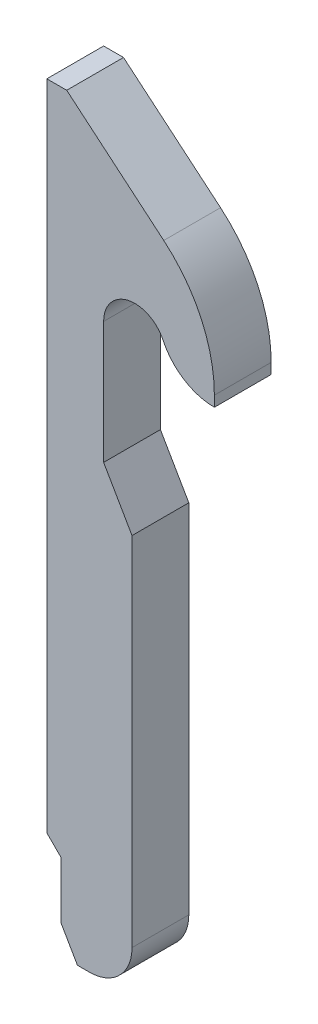
ISO-10303-21;
HEADER;
FILE_DESCRIPTION(('STEP AP214'),'2;1');
FILE_NAME('part.step','',(''),(''),'','','');
FILE_SCHEMA(('AUTOMOTIVE_DESIGN { 1 0 10303 214 1 1 1 1 }'));
ENDSEC;
DATA;
#1=APPLICATION_CONTEXT('core data for automotive mechanical design processes');
#2=APPLICATION_PROTOCOL_DEFINITION('international standard','automotive_design',2000,#1);
#3=PRODUCT_CONTEXT('',#1,'mechanical');
#4=PRODUCT('Part','Part','',(#3));
#5=PRODUCT_RELATED_PRODUCT_CATEGORY('part','',(#4));
#6=PRODUCT_DEFINITION_FORMATION('','',#4);
#7=PRODUCT_DEFINITION_CONTEXT('part definition',#1,'design');
#8=PRODUCT_DEFINITION('design','',#6,#7);
#9=PRODUCT_DEFINITION_SHAPE('','',#8);
#10=(LENGTH_UNIT() NAMED_UNIT(*) SI_UNIT(.MILLI.,.METRE.));
#11=(NAMED_UNIT(*) PLANE_ANGLE_UNIT() SI_UNIT($,.RADIAN.));
#12=(NAMED_UNIT(*) SI_UNIT($,.STERADIAN.) SOLID_ANGLE_UNIT());
#13=UNCERTAINTY_MEASURE_WITH_UNIT(LENGTH_MEASURE(1.E-05),#10,'distance_accuracy_value','');
#14=(GEOMETRIC_REPRESENTATION_CONTEXT(3) GLOBAL_UNCERTAINTY_ASSIGNED_CONTEXT((#13)) GLOBAL_UNIT_ASSIGNED_CONTEXT((#10,
#11,#12)) REPRESENTATION_CONTEXT('',''));
#15=CARTESIAN_POINT('',(0.,0.,0.));
#16=DIRECTION('',(0.,0.,1.));
#17=DIRECTION('',(1.,0.,0.));
#18=AXIS2_PLACEMENT_3D('',#15,#16,#17);
#19=CARTESIAN_POINT('',(5.,9.99999999999999,10.));
#20=DIRECTION('',(1.,0.,0.));
#21=DIRECTION('',(0.,0.,-1.));
#22=AXIS2_PLACEMENT_3D('',#19,#20,#21);
#23=PLANE('',#22);
#24=DIRECTION('',(0.,-1.,0.));
#25=VECTOR('',#24,1.);
#26=CARTESIAN_POINT('',(5.,10.,-10.));
#27=LINE('',#26,#25);
#28=CARTESIAN_POINT('',(5.,29.9999999999999,-10.));
#29=VERTEX_POINT('',#28);
#30=CARTESIAN_POINT('',(5.,10.,-10.));
#31=VERTEX_POINT('',#30);
#32=EDGE_CURVE('E310',#29,#31,#27,.T.);
#33=ORIENTED_EDGE('',*,*,#32,.T.);
#34=DIRECTION('',(0.,0.,-1.));
#35=VECTOR('',#34,1.);
#36=CARTESIAN_POINT('',(5.,9.99999999999999,10.));
#37=LINE('',#36,#35);
#38=CARTESIAN_POINT('',(5.,9.99999999999999,10.));
#39=VERTEX_POINT('',#38);
#40=EDGE_CURVE('E12',#39,#31,#37,.T.);
#41=ORIENTED_EDGE('',*,*,#40,.F.);
#42=DIRECTION('',(0.,-1.,0.));
#43=VECTOR('',#42,1.);
#44=CARTESIAN_POINT('',(5.,9.99999999999999,10.));
#45=LINE('',#44,#43);
#46=CARTESIAN_POINT('',(5.,29.9999999999999,10.));
#47=VERTEX_POINT('',#46);
#48=EDGE_CURVE('E247',#47,#39,#45,.T.);
#49=ORIENTED_EDGE('',*,*,#48,.F.);
#50=DIRECTION('',(0.,0.,-1.));
#51=VECTOR('',#50,1.);
#52=CARTESIAN_POINT('',(5.,29.9999999999999,10.));
#53=LINE('',#52,#51);
#54=EDGE_CURVE('E189',#47,#29,#53,.T.);
#55=ORIENTED_EDGE('',*,*,#54,.T.);
#56=EDGE_LOOP('',(#33,#41,#49,#55));
#57=FACE_BOUND('',#56,.T.);
#58=ADVANCED_FACE('F45',(#57),#23,.F.);
#59=CARTESIAN_POINT('',(5.,9.99999999999999,10.));
#60=DIRECTION('',(0.866025403784442,0.499999999999995,0.));
#61=DIRECTION('',(-0.499999999999995,0.866025403784442,0.));
#62=AXIS2_PLACEMENT_3D('',#59,#60,#61);
#63=PLANE('',#62);
#64=DIRECTION('',(0.499999999999995,-0.866025403784442,0.));
#65=VECTOR('',#64,1.);
#66=CARTESIAN_POINT('',(5.,10.,-10.));
#67=LINE('',#66,#65);
#68=CARTESIAN_POINT('',(10.7735026918962,0.,-10.));
#69=VERTEX_POINT('',#68);
#70=EDGE_CURVE('E301',#31,#69,#67,.T.);
#71=ORIENTED_EDGE('',*,*,#70,.T.);
#72=DIRECTION('',(0.,0.,-1.));
#73=VECTOR('',#72,1.);
#74=CARTESIAN_POINT('',(10.7735026918962,0.,10.));
#75=LINE('',#74,#73);
#76=CARTESIAN_POINT('',(10.7735026918962,0.,10.));
#77=VERTEX_POINT('',#76);
#78=EDGE_CURVE('E54',#77,#69,#75,.T.);
#79=ORIENTED_EDGE('',*,*,#78,.F.);
#80=DIRECTION('',(0.499999999999995,-0.866025403784442,0.));
#81=VECTOR('',#80,1.);
#82=CARTESIAN_POINT('',(5.,9.99999999999999,10.));
#83=LINE('',#82,#81);
#84=EDGE_CURVE('E130',#39,#77,#83,.T.);
#85=ORIENTED_EDGE('',*,*,#84,.F.);
#86=ORIENTED_EDGE('',*,*,#40,.T.);
#87=EDGE_LOOP('',(#71,#79,#85,#86));
#88=FACE_BOUND('',#87,.T.);
#89=ADVANCED_FACE('F380',(#88),#63,.F.);
#90=CARTESIAN_POINT('',(10.7735026918962,0.,10.));
#91=DIRECTION('',(0.,1.,0.));
#92=DIRECTION('',(0.,0.,1.));
#93=AXIS2_PLACEMENT_3D('',#90,#91,#92);
#94=PLANE('',#93);
#95=DIRECTION('',(1.,0.,0.));
#96=VECTOR('',#95,1.);
#97=CARTESIAN_POINT('',(10.7735026918962,0.,-10.));
#98=LINE('',#97,#96);
#99=CARTESIAN_POINT('',(15.,0.,-10.));
#100=VERTEX_POINT('',#99);
#101=EDGE_CURVE('E296',#69,#100,#98,.T.);
#102=ORIENTED_EDGE('',*,*,#101,.T.);
#103=DIRECTION('',(0.,0.,-1.));
#104=VECTOR('',#103,1.);
#105=CARTESIAN_POINT('',(15.,0.,10.));
#106=LINE('',#105,#104);
#107=CARTESIAN_POINT('',(15.,0.,10.));
#108=VERTEX_POINT('',#107);
#109=EDGE_CURVE('E287',#108,#100,#106,.T.);
#110=ORIENTED_EDGE('',*,*,#109,.F.);
#111=DIRECTION('',(1.,0.,0.));
#112=VECTOR('',#111,1.);
#113=CARTESIAN_POINT('',(10.7735026918962,0.,10.));
#114=LINE('',#113,#112);
#115=EDGE_CURVE('E240',#77,#108,#114,.T.);
#116=ORIENTED_EDGE('',*,*,#115,.F.);
#117=ORIENTED_EDGE('',*,*,#78,.T.);
#118=EDGE_LOOP('',(#102,#110,#116,#117));
#119=FACE_BOUND('',#118,.T.);
#120=ADVANCED_FACE('F294',(#119),#94,.F.);
#121=CARTESIAN_POINT('',(15.,15.,10.));
#122=DIRECTION('',(0.,0.,-1.));
#123=DIRECTION('',(-1.,0.,0.));
#124=AXIS2_PLACEMENT_3D('',#121,#122,#123);
#125=CYLINDRICAL_SURFACE('',#124,15.);
#126=CARTESIAN_POINT('',(15.,15.,-10.));
#127=DIRECTION('',(0.,0.,1.));
#128=DIRECTION('',(1.,0.,0.));
#129=AXIS2_PLACEMENT_3D('',#126,#127,#128);
#130=CIRCLE('',#129,15.);
#131=CARTESIAN_POINT('',(30.,15.,-10.));
#132=VERTEX_POINT('',#131);
#133=EDGE_CURVE('E303',#100,#132,#130,.T.);
#134=ORIENTED_EDGE('',*,*,#133,.T.);
#135=DIRECTION('',(0.,0.,-1.));
#136=VECTOR('',#135,1.);
#137=CARTESIAN_POINT('',(30.,15.,10.));
#138=LINE('',#137,#136);
#139=CARTESIAN_POINT('',(30.,15.,10.));
#140=VERTEX_POINT('',#139);
#141=EDGE_CURVE('E283',#140,#132,#138,.T.);
#142=ORIENTED_EDGE('',*,*,#141,.F.);
#143=CARTESIAN_POINT('',(15.,15.,10.));
#144=DIRECTION('',(0.,0.,1.));
#145=DIRECTION('',(1.,0.,0.));
#146=AXIS2_PLACEMENT_3D('',#143,#144,#145);
#147=CIRCLE('',#146,15.);
#148=EDGE_CURVE('E237',#108,#140,#147,.T.);
#149=ORIENTED_EDGE('',*,*,#148,.F.);
#150=ORIENTED_EDGE('',*,*,#109,.T.);
#151=EDGE_LOOP('',(#134,#142,#149,#150));
#152=FACE_BOUND('',#151,.T.);
#153=ADVANCED_FACE('F387',(#152),#125,.T.);
#154=CARTESIAN_POINT('',(30.,15.,10.));
#155=DIRECTION('',(-1.,0.,0.));
#156=DIRECTION('',(0.,0.,1.));
#157=AXIS2_PLACEMENT_3D('',#154,#155,#156);
#158=PLANE('',#157);
#159=DIRECTION('',(0.,1.,0.));
#160=VECTOR('',#159,1.);
#161=CARTESIAN_POINT('',(30.,15.,-10.));
#162=LINE('',#161,#160);
#163=CARTESIAN_POINT('',(30.,140.679491924311,-10.));
#164=VERTEX_POINT('',#163);
#165=EDGE_CURVE('E308',#132,#164,#162,.T.);
#166=ORIENTED_EDGE('',*,*,#165,.T.);
#167=DIRECTION('',(0.,0.,-1.));
#168=VECTOR('',#167,1.);
#169=CARTESIAN_POINT('',(30.,140.679491924311,10.));
#170=LINE('',#169,#168);
#171=CARTESIAN_POINT('',(30.,140.679491924311,10.));
#172=VERTEX_POINT('',#171);
#173=EDGE_CURVE('E280',#172,#164,#170,.T.);
#174=ORIENTED_EDGE('',*,*,#173,.F.);
#175=DIRECTION('',(0.,1.,0.));
#176=VECTOR('',#175,1.);
#177=CARTESIAN_POINT('',(30.,15.,10.));
#178=LINE('',#177,#176);
#179=EDGE_CURVE('E229',#140,#172,#178,.T.);
#180=ORIENTED_EDGE('',*,*,#179,.F.);
#181=ORIENTED_EDGE('',*,*,#141,.T.);
#182=EDGE_LOOP('',(#166,#174,#180,#181));
#183=FACE_BOUND('',#182,.T.);
#184=ADVANCED_FACE('F343',(#183),#158,.F.);
#185=CARTESIAN_POINT('',(30.,140.679491924311,10.));
#186=DIRECTION('',(-0.866025403784438,-0.5,0.));
#187=DIRECTION('',(0.500000000000001,-0.866025403784438,0.));
#188=AXIS2_PLACEMENT_3D('',#185,#186,#187);
#189=PLANE('',#188);
#190=DIRECTION('',(-0.5,0.866025403784438,0.));
#191=VECTOR('',#190,1.);
#192=CARTESIAN_POINT('',(30.,140.679491924311,-10.));
#193=LINE('',#192,#191);
#194=CARTESIAN_POINT('',(20.,158.,-10.));
#195=VERTEX_POINT('',#194);
#196=EDGE_CURVE('E314',#164,#195,#193,.T.);
#197=ORIENTED_EDGE('',*,*,#196,.T.);
#198=DIRECTION('',(0.,0.,-1.));
#199=VECTOR('',#198,1.);
#200=CARTESIAN_POINT('',(20.,158.,10.));
#201=LINE('',#200,#199);
#202=CARTESIAN_POINT('',(20.,158.,10.));
#203=VERTEX_POINT('',#202);
#204=EDGE_CURVE('E277',#203,#195,#201,.T.);
#205=ORIENTED_EDGE('',*,*,#204,.F.);
#206=DIRECTION('',(-0.5,0.866025403784438,0.));
#207=VECTOR('',#206,1.);
#208=CARTESIAN_POINT('',(30.,140.679491924311,10.));
#209=LINE('',#208,#207);
#210=EDGE_CURVE('E225',#172,#203,#209,.T.);
#211=ORIENTED_EDGE('',*,*,#210,.F.);
#212=ORIENTED_EDGE('',*,*,#173,.T.);
#213=EDGE_LOOP('',(#197,#205,#211,#212));
#214=FACE_BOUND('',#213,.T.);
#215=ADVANCED_FACE('F346',(#214),#189,.F.);
#216=CARTESIAN_POINT('',(20.,158.,10.));
#217=DIRECTION('',(-1.,0.,0.));
#218=DIRECTION('',(0.,0.,1.));
#219=AXIS2_PLACEMENT_3D('',#216,#217,#218);
#220=PLANE('',#219);
#221=DIRECTION('',(0.,1.,0.));
#222=VECTOR('',#221,1.);
#223=CARTESIAN_POINT('',(20.,158.,-10.));
#224=LINE('',#223,#222);
#225=CARTESIAN_POINT('',(20.,201.,-10.));
#226=VERTEX_POINT('',#225);
#227=EDGE_CURVE('E316',#195,#226,#224,.T.);
#228=ORIENTED_EDGE('',*,*,#227,.T.);
#229=DIRECTION('',(0.,0.,-1.));
#230=VECTOR('',#229,1.);
#231=CARTESIAN_POINT('',(20.,201.,10.));
#232=LINE('',#231,#230);
#233=CARTESIAN_POINT('',(20.,201.,10.));
#234=VERTEX_POINT('',#233);
#235=EDGE_CURVE('E274',#234,#226,#232,.T.);
#236=ORIENTED_EDGE('',*,*,#235,.F.);
#237=DIRECTION('',(0.,1.,0.));
#238=VECTOR('',#237,1.);
#239=CARTESIAN_POINT('',(20.,158.,10.));
#240=LINE('',#239,#238);
#241=EDGE_CURVE('E221',#203,#234,#240,.T.);
#242=ORIENTED_EDGE('',*,*,#241,.F.);
#243=ORIENTED_EDGE('',*,*,#204,.T.);
#244=EDGE_LOOP('',(#228,#236,#242,#243));
#245=FACE_BOUND('',#244,.T.);
#246=ADVANCED_FACE('F351',(#245),#220,.F.);
#247=CARTESIAN_POINT('',(31.,201.,10.));
#248=DIRECTION('',(0.,0.,-1.));
#249=DIRECTION('',(-1.,0.,0.));
#250=AXIS2_PLACEMENT_3D('',#247,#248,#249);
#251=CYLINDRICAL_SURFACE('',#250,11.);
#252=CARTESIAN_POINT('',(31.,201.,-10.));
#253=DIRECTION('',(0.,0.,-1.));
#254=DIRECTION('',(1.,0.,0.));
#255=AXIS2_PLACEMENT_3D('',#252,#253,#254);
#256=CIRCLE('',#255,11.);
#257=CARTESIAN_POINT('',(40.9354838709677,205.720821988779,-10.));
#258=VERTEX_POINT('',#257);
#259=EDGE_CURVE('E318',#226,#258,#256,.T.);
#260=ORIENTED_EDGE('',*,*,#259,.T.);
#261=DIRECTION('',(0.,0.,-1.));
#262=VECTOR('',#261,1.);
#263=CARTESIAN_POINT('',(40.9354838709677,205.720821988779,10.));
#264=LINE('',#263,#262);
#265=CARTESIAN_POINT('',(40.9354838709677,205.720821988779,10.));
#266=VERTEX_POINT('',#265);
#267=EDGE_CURVE('E271',#266,#258,#264,.T.);
#268=ORIENTED_EDGE('',*,*,#267,.F.);
#269=CARTESIAN_POINT('',(31.,201.,10.));
#270=DIRECTION('',(0.,0.,-1.));
#271=DIRECTION('',(1.,0.,0.));
#272=AXIS2_PLACEMENT_3D('',#269,#270,#271);
#273=CIRCLE('',#272,11.);
#274=EDGE_CURVE('E218',#234,#266,#273,.T.);
#275=ORIENTED_EDGE('',*,*,#274,.F.);
#276=ORIENTED_EDGE('',*,*,#235,.T.);
#277=EDGE_LOOP('',(#260,#268,#275,#276));
#278=FACE_BOUND('',#277,.T.);
#279=ADVANCED_FACE('F357',(#278),#251,.F.);
#280=CARTESIAN_POINT('',(59.,214.30413469565,10.));
#281=DIRECTION('',(0.,0.,-1.));
#282=DIRECTION('',(-1.,0.,0.));
#283=AXIS2_PLACEMENT_3D('',#280,#281,#282);
#284=CYLINDRICAL_SURFACE('',#283,20.);
#285=CARTESIAN_POINT('',(59.,214.30413469565,-10.));
#286=DIRECTION('',(0.,0.,1.));
#287=DIRECTION('',(1.,0.,0.));
#288=AXIS2_PLACEMENT_3D('',#285,#286,#287);
#289=CIRCLE('',#288,20.);
#290=CARTESIAN_POINT('',(59.,194.30413469565,-10.));
#291=VERTEX_POINT('',#290);
#292=EDGE_CURVE('E320',#258,#291,#289,.T.);
#293=ORIENTED_EDGE('',*,*,#292,.T.);
#294=DIRECTION('',(0.,0.,-1.));
#295=VECTOR('',#294,1.);
#296=CARTESIAN_POINT('',(59.,194.30413469565,10.));
#297=LINE('',#296,#295);
#298=CARTESIAN_POINT('',(59.,194.30413469565,10.));
#299=VERTEX_POINT('',#298);
#300=EDGE_CURVE('E268',#299,#291,#297,.T.);
#301=ORIENTED_EDGE('',*,*,#300,.F.);
#302=CARTESIAN_POINT('',(59.,214.30413469565,10.));
#303=DIRECTION('',(0.,0.,1.));
#304=DIRECTION('',(1.,0.,0.));
#305=AXIS2_PLACEMENT_3D('',#302,#303,#304);
#306=CIRCLE('',#305,20.);
#307=EDGE_CURVE('E210',#266,#299,#306,.T.);
#308=ORIENTED_EDGE('',*,*,#307,.F.);
#309=ORIENTED_EDGE('',*,*,#267,.T.);
#310=EDGE_LOOP('',(#293,#301,#308,#309));
#311=FACE_BOUND('',#310,.T.);
#312=ADVANCED_FACE('F361',(#311),#284,.T.);
#313=CARTESIAN_POINT('',(59.,198.,10.));
#314=DIRECTION('',(-1.,0.,0.));
#315=DIRECTION('',(0.,0.,1.));
#316=AXIS2_PLACEMENT_3D('',#313,#314,#315);
#317=PLANE('',#316);
#318=DIRECTION('',(0.,1.,0.));
#319=VECTOR('',#318,1.);
#320=CARTESIAN_POINT('',(59.,198.,-10.));
#321=LINE('',#320,#319);
#322=CARTESIAN_POINT('',(59.,198.,-10.));
#323=VERTEX_POINT('',#322);
#324=EDGE_CURVE('E322',#291,#323,#321,.T.);
#325=ORIENTED_EDGE('',*,*,#324,.T.);
#326=DIRECTION('',(0.,0.,-1.));
#327=VECTOR('',#326,1.);
#328=CARTESIAN_POINT('',(59.,198.,10.));
#329=LINE('',#328,#327);
#330=CARTESIAN_POINT('',(59.,198.,10.));
#331=VERTEX_POINT('',#330);
#332=EDGE_CURVE('E265',#331,#323,#329,.T.);
#333=ORIENTED_EDGE('',*,*,#332,.F.);
#334=DIRECTION('',(0.,1.,0.));
#335=VECTOR('',#334,1.);
#336=CARTESIAN_POINT('',(59.,198.,10.));
#337=LINE('',#336,#335);
#338=EDGE_CURVE('E206',#299,#331,#337,.T.);
#339=ORIENTED_EDGE('',*,*,#338,.F.);
#340=ORIENTED_EDGE('',*,*,#300,.T.);
#341=EDGE_LOOP('',(#325,#333,#339,#340));
#342=FACE_BOUND('',#341,.T.);
#343=ADVANCED_FACE('F367',(#342),#317,.F.);
#344=CARTESIAN_POINT('',(9.00000000000001,198.,10.));
#345=DIRECTION('',(0.,0.,-1.));
#346=DIRECTION('',(-1.,0.,0.));
#347=AXIS2_PLACEMENT_3D('',#344,#345,#346);
#348=CYLINDRICAL_SURFACE('',#347,50.);
#349=CARTESIAN_POINT('',(9.00000000000001,198.,-10.));
#350=DIRECTION('',(0.,0.,1.));
#351=DIRECTION('',(-1.,0.,0.));
#352=AXIS2_PLACEMENT_3D('',#349,#350,#351);
#353=CIRCLE('',#352,50.);
#354=CARTESIAN_POINT('',(41.1731906773165,236.273826587383,-10.));
#355=VERTEX_POINT('',#354);
#356=EDGE_CURVE('E324',#323,#355,#353,.T.);
#357=ORIENTED_EDGE('',*,*,#356,.T.);
#358=DIRECTION('',(0.,0.,-1.));
#359=VECTOR('',#358,1.);
#360=CARTESIAN_POINT('',(41.1731906773165,236.273826587383,10.));
#361=LINE('',#360,#359);
#362=CARTESIAN_POINT('',(41.1731906773165,236.273826587383,10.));
#363=VERTEX_POINT('',#362);
#364=EDGE_CURVE('E262',#363,#355,#361,.T.);
#365=ORIENTED_EDGE('',*,*,#364,.F.);
#366=CARTESIAN_POINT('',(9.00000000000001,198.,10.));
#367=DIRECTION('',(0.,0.,1.));
#368=DIRECTION('',(-1.,0.,0.));
#369=AXIS2_PLACEMENT_3D('',#366,#367,#368);
#370=CIRCLE('',#369,50.);
#371=EDGE_CURVE('E202',#331,#363,#370,.T.);
#372=ORIENTED_EDGE('',*,*,#371,.F.);
#373=ORIENTED_EDGE('',*,*,#332,.T.);
#374=EDGE_LOOP('',(#357,#365,#372,#373));
#375=FACE_BOUND('',#374,.T.);
#376=ADVANCED_FACE('F370',(#375),#348,.T.);
#377=CARTESIAN_POINT('',(41.1731906773165,236.273826587383,10.));
#378=DIRECTION('',(-0.643463813546331,-0.765476531747651,0.));
#379=DIRECTION('',(0.765476531747651,-0.643463813546331,0.));
#380=AXIS2_PLACEMENT_3D('',#377,#378,#379);
#381=PLANE('',#380);
#382=DIRECTION('',(-0.765476531747651,0.643463813546331,0.));
#383=VECTOR('',#382,1.);
#384=CARTESIAN_POINT('',(41.1731906773165,236.273826587383,-10.));
#385=LINE('',#384,#383);
#386=CARTESIAN_POINT('',(7.00000000000001,265.,-10.));
#387=VERTEX_POINT('',#386);
#388=EDGE_CURVE('E326',#355,#387,#385,.T.);
#389=ORIENTED_EDGE('',*,*,#388,.T.);
#390=DIRECTION('',(0.,0.,-1.));
#391=VECTOR('',#390,1.);
#392=CARTESIAN_POINT('',(7.00000000000001,265.,10.));
#393=LINE('',#392,#391);
#394=CARTESIAN_POINT('',(7.00000000000001,265.,10.));
#395=VERTEX_POINT('',#394);
#396=EDGE_CURVE('E182',#395,#387,#393,.T.);
#397=ORIENTED_EDGE('',*,*,#396,.F.);
#398=DIRECTION('',(-0.765476531747651,0.643463813546331,0.));
#399=VECTOR('',#398,1.);
#400=CARTESIAN_POINT('',(41.1731906773165,236.273826587383,10.));
#401=LINE('',#400,#399);
#402=EDGE_CURVE('E172',#363,#395,#401,.T.);
#403=ORIENTED_EDGE('',*,*,#402,.F.);
#404=ORIENTED_EDGE('',*,*,#364,.T.);
#405=EDGE_LOOP('',(#389,#397,#403,#404));
#406=FACE_BOUND('',#405,.T.);
#407=ADVANCED_FACE('F329',(#406),#381,.F.);
#408=CARTESIAN_POINT('',(0.,265.,10.));
#409=DIRECTION('',(0.,-1.,0.));
#410=DIRECTION('',(0.,0.,-1.));
#411=AXIS2_PLACEMENT_3D('',#408,#409,#410);
#412=PLANE('',#411);
#413=DIRECTION('',(-1.,0.,0.));
#414=VECTOR('',#413,1.);
#415=CARTESIAN_POINT('',(0.,265.,-10.));
#416=LINE('',#415,#414);
#417=CARTESIAN_POINT('',(0.,265.,-10.));
#418=VERTEX_POINT('',#417);
#419=EDGE_CURVE('E181',#387,#418,#416,.T.);
#420=ORIENTED_EDGE('',*,*,#419,.T.);
#421=DIRECTION('',(0.,0.,-1.));
#422=VECTOR('',#421,1.);
#423=CARTESIAN_POINT('',(0.,265.,10.));
#424=LINE('',#423,#422);
#425=CARTESIAN_POINT('',(0.,265.,10.));
#426=VERTEX_POINT('',#425);
#427=EDGE_CURVE('E178',#426,#418,#424,.T.);
#428=ORIENTED_EDGE('',*,*,#427,.F.);
#429=DIRECTION('',(-1.,0.,0.));
#430=VECTOR('',#429,1.);
#431=CARTESIAN_POINT('',(0.,265.,10.));
#432=LINE('',#431,#430);
#433=EDGE_CURVE('E166',#395,#426,#432,.T.);
#434=ORIENTED_EDGE('',*,*,#433,.F.);
#435=ORIENTED_EDGE('',*,*,#396,.T.);
#436=EDGE_LOOP('',(#420,#428,#434,#435));
#437=FACE_BOUND('',#436,.T.);
#438=ADVANCED_FACE('F179',(#437),#412,.F.);
#439=CARTESIAN_POINT('',(0.,35.,10.));
#440=DIRECTION('',(1.,0.,0.));
#441=DIRECTION('',(0.,0.,-1.));
#442=AXIS2_PLACEMENT_3D('',#439,#440,#441);
#443=PLANE('',#442);
#444=DIRECTION('',(0.,-1.,0.));
#445=VECTOR('',#444,1.);
#446=CARTESIAN_POINT('',(0.,35.,-10.));
#447=LINE('',#446,#445);
#448=CARTESIAN_POINT('',(0.,35.,-10.));
#449=VERTEX_POINT('',#448);
#450=EDGE_CURVE('E114',#418,#449,#447,.T.);
#451=ORIENTED_EDGE('',*,*,#450,.T.);
#452=DIRECTION('',(0.,0.,-1.));
#453=VECTOR('',#452,1.);
#454=CARTESIAN_POINT('',(0.,35.,10.));
#455=LINE('',#454,#453);
#456=CARTESIAN_POINT('',(0.,35.,10.));
#457=VERTEX_POINT('',#456);
#458=EDGE_CURVE('E183',#457,#449,#455,.T.);
#459=ORIENTED_EDGE('',*,*,#458,.F.);
#460=DIRECTION('',(0.,-1.,0.));
#461=VECTOR('',#460,1.);
#462=CARTESIAN_POINT('',(0.,35.,10.));
#463=LINE('',#462,#461);
#464=EDGE_CURVE('E170',#426,#457,#463,.T.);
#465=ORIENTED_EDGE('',*,*,#464,.F.);
#466=ORIENTED_EDGE('',*,*,#427,.T.);
#467=EDGE_LOOP('',(#451,#459,#465,#466));
#468=FACE_BOUND('',#467,.T.);
#469=ADVANCED_FACE('F185',(#468),#443,.F.);
#470=CARTESIAN_POINT('',(0.,35.,10.));
#471=DIRECTION('',(0.707106781186551,0.707106781186544,0.));
#472=DIRECTION('',(-0.707106781186544,0.707106781186551,0.));
#473=AXIS2_PLACEMENT_3D('',#470,#471,#472);
#474=PLANE('',#473);
#475=DIRECTION('',(0.707106781186544,-0.707106781186551,0.));
#476=VECTOR('',#475,1.);
#477=CARTESIAN_POINT('',(0.,35.,-10.));
#478=LINE('',#477,#476);
#479=EDGE_CURVE('E120',#449,#29,#478,.T.);
#480=ORIENTED_EDGE('',*,*,#479,.T.);
#481=ORIENTED_EDGE('',*,*,#54,.F.);
#482=DIRECTION('',(0.707106781186544,-0.707106781186551,0.));
#483=VECTOR('',#482,1.);
#484=CARTESIAN_POINT('',(0.,35.,10.));
#485=LINE('',#484,#483);
#486=EDGE_CURVE('E62',#457,#47,#485,.T.);
#487=ORIENTED_EDGE('',*,*,#486,.F.);
#488=ORIENTED_EDGE('',*,*,#458,.T.);
#489=EDGE_LOOP('',(#480,#481,#487,#488));
#490=FACE_BOUND('',#489,.T.);
#491=ADVANCED_FACE('F437',(#490),#474,.F.);
#492=CARTESIAN_POINT('',(9.00000000000001,198.,10.));
#493=DIRECTION('',(0.,0.,-1.));
#494=DIRECTION('',(-1.,0.,0.));
#495=AXIS2_PLACEMENT_3D('',#492,#493,#494);
#496=PLANE('',#495);
#497=ORIENTED_EDGE('',*,*,#48,.T.);
#498=ORIENTED_EDGE('',*,*,#84,.T.);
#499=ORIENTED_EDGE('',*,*,#115,.T.);
#500=ORIENTED_EDGE('',*,*,#148,.T.);
#501=ORIENTED_EDGE('',*,*,#179,.T.);
#502=ORIENTED_EDGE('',*,*,#210,.T.);
#503=ORIENTED_EDGE('',*,*,#241,.T.);
#504=ORIENTED_EDGE('',*,*,#274,.T.);
#505=ORIENTED_EDGE('',*,*,#307,.T.);
#506=ORIENTED_EDGE('',*,*,#338,.T.);
#507=ORIENTED_EDGE('',*,*,#371,.T.);
#508=ORIENTED_EDGE('',*,*,#402,.T.);
#509=ORIENTED_EDGE('',*,*,#433,.T.);
#510=ORIENTED_EDGE('',*,*,#464,.T.);
#511=ORIENTED_EDGE('',*,*,#486,.T.);
#512=EDGE_LOOP('',(#497,#498,#499,#500,#501,#502,#503,#504,#505,#506,#507,#508,#509,#510,#511));
#513=FACE_BOUND('',#512,.T.);
#514=ADVANCED_FACE('F168',(#513),#496,.F.);
#515=CARTESIAN_POINT('',(9.00000000000001,198.,-10.));
#516=DIRECTION('',(0.,0.,-1.));
#517=DIRECTION('',(-1.,0.,0.));
#518=AXIS2_PLACEMENT_3D('',#515,#516,#517);
#519=PLANE('',#518);
#520=ORIENTED_EDGE('',*,*,#32,.F.);
#521=ORIENTED_EDGE('',*,*,#479,.F.);
#522=ORIENTED_EDGE('',*,*,#450,.F.);
#523=ORIENTED_EDGE('',*,*,#419,.F.);
#524=ORIENTED_EDGE('',*,*,#388,.F.);
#525=ORIENTED_EDGE('',*,*,#356,.F.);
#526=ORIENTED_EDGE('',*,*,#324,.F.);
#527=ORIENTED_EDGE('',*,*,#292,.F.);
#528=ORIENTED_EDGE('',*,*,#259,.F.);
#529=ORIENTED_EDGE('',*,*,#227,.F.);
#530=ORIENTED_EDGE('',*,*,#196,.F.);
#531=ORIENTED_EDGE('',*,*,#165,.F.);
#532=ORIENTED_EDGE('',*,*,#133,.F.);
#533=ORIENTED_EDGE('',*,*,#101,.F.);
#534=ORIENTED_EDGE('',*,*,#70,.F.);
#535=EDGE_LOOP('',(#520,#521,#522,#523,#524,#525,#526,#527,#528,#529,#530,#531,#532,#533,#534));
#536=FACE_BOUND('',#535,.T.);
#537=ADVANCED_FACE('F300',(#536),#519,.T.);
#538=CLOSED_SHELL('',(#58,#89,#120,#153,#184,#215,#246,#279,#312,#343,#376,#407,#438,#469,#491,
#514,#537));
#539=MANIFOLD_SOLID_BREP('B2',#538);
#540=ADVANCED_BREP_SHAPE_REPRESENTATION('',(#18,#539),#14);
#541=SHAPE_DEFINITION_REPRESENTATION(#9,#540);
ENDSEC;
END-ISO-10303-21;
